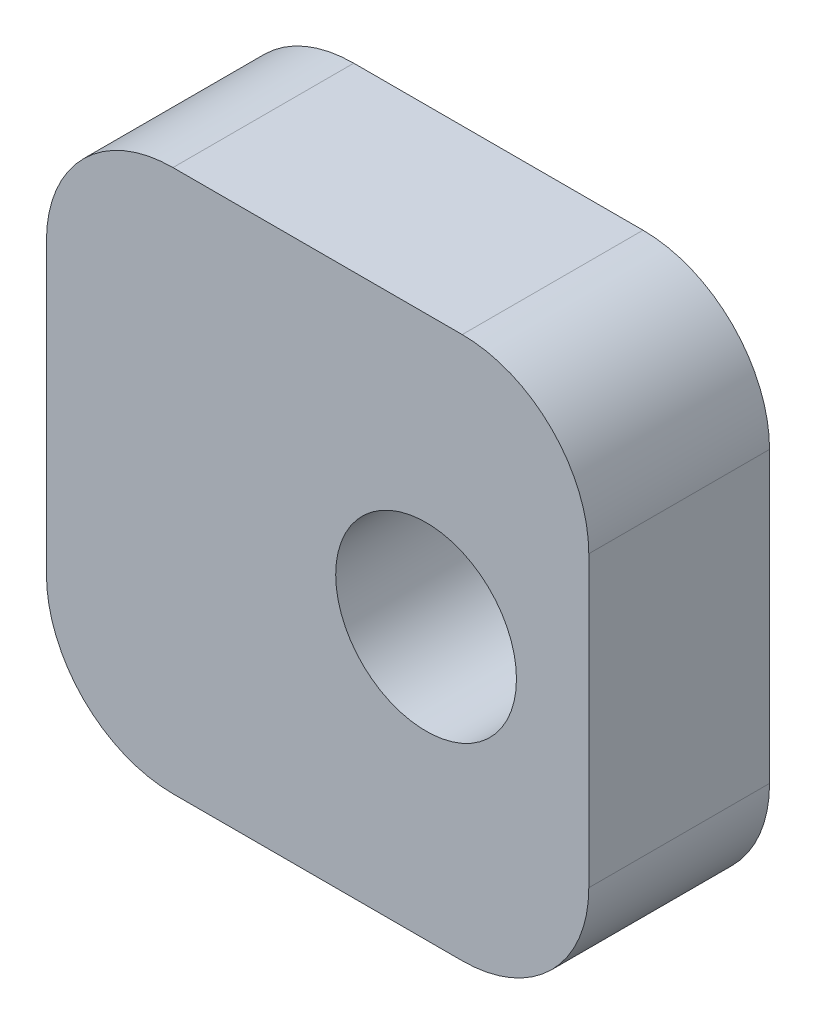
ISO-10303-21;
HEADER;
FILE_DESCRIPTION(('STEP AP214'),'2;1');
FILE_NAME('part.step','',(''),(''),'','','');
FILE_SCHEMA(('AUTOMOTIVE_DESIGN { 1 0 10303 214 1 1 1 1 }'));
ENDSEC;
DATA;
#1=APPLICATION_CONTEXT('core data for automotive mechanical design processes');
#2=APPLICATION_PROTOCOL_DEFINITION('international standard','automotive_design',2000,#1);
#3=PRODUCT_CONTEXT('',#1,'mechanical');
#4=PRODUCT('Part','Part','',(#3));
#5=PRODUCT_RELATED_PRODUCT_CATEGORY('part','',(#4));
#6=PRODUCT_DEFINITION_FORMATION('','',#4);
#7=PRODUCT_DEFINITION_CONTEXT('part definition',#1,'design');
#8=PRODUCT_DEFINITION('design','',#6,#7);
#9=PRODUCT_DEFINITION_SHAPE('','',#8);
#10=(LENGTH_UNIT() NAMED_UNIT(*) SI_UNIT(.MILLI.,.METRE.));
#11=(NAMED_UNIT(*) PLANE_ANGLE_UNIT() SI_UNIT($,.RADIAN.));
#12=(NAMED_UNIT(*) SI_UNIT($,.STERADIAN.) SOLID_ANGLE_UNIT());
#13=UNCERTAINTY_MEASURE_WITH_UNIT(LENGTH_MEASURE(1.E-05),#10,'distance_accuracy_value','');
#14=(GEOMETRIC_REPRESENTATION_CONTEXT(3) GLOBAL_UNCERTAINTY_ASSIGNED_CONTEXT((#13)) GLOBAL_UNIT_ASSIGNED_CONTEXT((#10,
#11,#12)) REPRESENTATION_CONTEXT('',''));
#15=CARTESIAN_POINT('',(0.,0.,0.));
#16=DIRECTION('',(0.,0.,1.));
#17=DIRECTION('',(1.,0.,0.));
#18=AXIS2_PLACEMENT_3D('',#15,#16,#17);
#19=CARTESIAN_POINT('',(0.,0.,10.));
#20=DIRECTION('',(1.,0.,0.));
#21=DIRECTION('',(0.,0.,-1.));
#22=AXIS2_PLACEMENT_3D('',#19,#20,#21);
#23=PLANE('',#22);
#24=CARTESIAN_POINT('',(0.,15.,5.));
#25=DIRECTION('',(-1.,0.,0.));
#26=DIRECTION('',(0.,0.,1.));
#27=AXIS2_PLACEMENT_3D('',#24,#25,#26);
#28=CIRCLE('',#27,3.);
#29=CARTESIAN_POINT('',(0.,15.,8.));
#30=VERTEX_POINT('',#29);
#31=EDGE_CURVE('E180',#30,#30,#28,.T.);
#32=ORIENTED_EDGE('',*,*,#31,.F.);
#33=EDGE_LOOP('',(#32));
#34=FACE_BOUND('',#33,.T.);
#35=DIRECTION('',(0.,-1.,0.));
#36=VECTOR('',#35,1.);
#37=CARTESIAN_POINT('',(0.,0.,10.));
#38=LINE('',#37,#36);
#39=CARTESIAN_POINT('',(0.,23.,10.));
#40=VERTEX_POINT('',#39);
#41=CARTESIAN_POINT('',(0.,7.,10.));
#42=VERTEX_POINT('',#41);
#43=EDGE_CURVE('E129',#40,#42,#38,.T.);
#44=ORIENTED_EDGE('',*,*,#43,.F.);
#45=DIRECTION('',(0.,0.,-1.));
#46=VECTOR('',#45,1.);
#47=CARTESIAN_POINT('',(0.,23.,10.));
#48=LINE('',#47,#46);
#49=CARTESIAN_POINT('',(0.,23.,0.));
#50=VERTEX_POINT('',#49);
#51=EDGE_CURVE('E155',#40,#50,#48,.T.);
#52=ORIENTED_EDGE('',*,*,#51,.T.);
#53=DIRECTION('',(0.,-1.,0.));
#54=VECTOR('',#53,1.);
#55=CARTESIAN_POINT('',(0.,0.,0.));
#56=LINE('',#55,#54);
#57=CARTESIAN_POINT('',(0.,7.,0.));
#58=VERTEX_POINT('',#57);
#59=EDGE_CURVE('E161',#50,#58,#56,.T.);
#60=ORIENTED_EDGE('',*,*,#59,.T.);
#61=DIRECTION('',(0.,0.,-1.));
#62=VECTOR('',#61,1.);
#63=CARTESIAN_POINT('',(0.,7.,10.));
#64=LINE('',#63,#62);
#65=EDGE_CURVE('E153',#58,#42,#64,.F.);
#66=ORIENTED_EDGE('',*,*,#65,.T.);
#67=EDGE_LOOP('',(#44,#52,#60,#66));
#68=FACE_BOUND('',#67,.T.);
#69=ADVANCED_FACE('F37',(#34,#68),#23,.F.);
#70=CARTESIAN_POINT('',(0.,0.,10.));
#71=DIRECTION('',(0.,1.,0.));
#72=DIRECTION('',(0.,0.,1.));
#73=AXIS2_PLACEMENT_3D('',#70,#71,#72);
#74=PLANE('',#73);
#75=DIRECTION('',(1.,0.,0.));
#76=VECTOR('',#75,1.);
#77=CARTESIAN_POINT('',(0.,0.,10.));
#78=LINE('',#77,#76);
#79=CARTESIAN_POINT('',(7.,0.,10.));
#80=VERTEX_POINT('',#79);
#81=CARTESIAN_POINT('',(23.,0.,10.));
#82=VERTEX_POINT('',#81);
#83=EDGE_CURVE('E132',#80,#82,#78,.T.);
#84=ORIENTED_EDGE('',*,*,#83,.F.);
#85=DIRECTION('',(0.,0.,-1.));
#86=VECTOR('',#85,1.);
#87=CARTESIAN_POINT('',(7.,0.,10.));
#88=LINE('',#87,#86);
#89=CARTESIAN_POINT('',(7.,0.,0.));
#90=VERTEX_POINT('',#89);
#91=EDGE_CURVE('E11',#80,#90,#88,.T.);
#92=ORIENTED_EDGE('',*,*,#91,.T.);
#93=DIRECTION('',(1.,0.,0.));
#94=VECTOR('',#93,1.);
#95=CARTESIAN_POINT('',(0.,0.,0.));
#96=LINE('',#95,#94);
#97=CARTESIAN_POINT('',(23.,0.,0.));
#98=VERTEX_POINT('',#97);
#99=EDGE_CURVE('E134',#90,#98,#96,.T.);
#100=ORIENTED_EDGE('',*,*,#99,.T.);
#101=DIRECTION('',(0.,0.,-1.));
#102=VECTOR('',#101,1.);
#103=CARTESIAN_POINT('',(23.,0.,10.));
#104=LINE('',#103,#102);
#105=EDGE_CURVE('E45',#98,#82,#104,.F.);
#106=ORIENTED_EDGE('',*,*,#105,.T.);
#107=EDGE_LOOP('',(#84,#92,#100,#106));
#108=FACE_BOUND('',#107,.T.);
#109=ADVANCED_FACE('F195',(#108),#74,.F.);
#110=CARTESIAN_POINT('',(30.,0.,10.));
#111=DIRECTION('',(-1.,0.,0.));
#112=DIRECTION('',(0.,0.,1.));
#113=AXIS2_PLACEMENT_3D('',#110,#111,#112);
#114=PLANE('',#113);
#115=DIRECTION('',(0.,1.,0.));
#116=VECTOR('',#115,1.);
#117=CARTESIAN_POINT('',(30.,0.,0.));
#118=LINE('',#117,#116);
#119=CARTESIAN_POINT('',(30.,7.,0.));
#120=VERTEX_POINT('',#119);
#121=CARTESIAN_POINT('',(30.,23.,0.));
#122=VERTEX_POINT('',#121);
#123=EDGE_CURVE('E130',#120,#122,#118,.T.);
#124=ORIENTED_EDGE('',*,*,#123,.T.);
#125=DIRECTION('',(0.,0.,-1.));
#126=VECTOR('',#125,1.);
#127=CARTESIAN_POINT('',(30.,23.,10.));
#128=LINE('',#127,#126);
#129=CARTESIAN_POINT('',(30.,23.,10.));
#130=VERTEX_POINT('',#129);
#131=EDGE_CURVE('E108',#122,#130,#128,.F.);
#132=ORIENTED_EDGE('',*,*,#131,.T.);
#133=DIRECTION('',(0.,1.,0.));
#134=VECTOR('',#133,1.);
#135=CARTESIAN_POINT('',(30.,0.,10.));
#136=LINE('',#135,#134);
#137=CARTESIAN_POINT('',(30.,7.,10.));
#138=VERTEX_POINT('',#137);
#139=EDGE_CURVE('E173',#138,#130,#136,.T.);
#140=ORIENTED_EDGE('',*,*,#139,.F.);
#141=DIRECTION('',(0.,0.,-1.));
#142=VECTOR('',#141,1.);
#143=CARTESIAN_POINT('',(30.,7.,10.));
#144=LINE('',#143,#142);
#145=EDGE_CURVE('E113',#138,#120,#144,.T.);
#146=ORIENTED_EDGE('',*,*,#145,.T.);
#147=EDGE_LOOP('',(#124,#132,#140,#146));
#148=FACE_BOUND('',#147,.T.);
#149=ADVANCED_FACE('F200',(#148),#114,.F.);
#150=CARTESIAN_POINT('',(0.,30.,10.));
#151=DIRECTION('',(0.,-1.,0.));
#152=DIRECTION('',(0.,0.,-1.));
#153=AXIS2_PLACEMENT_3D('',#150,#151,#152);
#154=PLANE('',#153);
#155=DIRECTION('',(-1.,0.,0.));
#156=VECTOR('',#155,1.);
#157=CARTESIAN_POINT('',(0.,30.,10.));
#158=LINE('',#157,#156);
#159=CARTESIAN_POINT('',(23.,30.,10.));
#160=VERTEX_POINT('',#159);
#161=CARTESIAN_POINT('',(7.,30.,10.));
#162=VERTEX_POINT('',#161);
#163=EDGE_CURVE('E123',#160,#162,#158,.T.);
#164=ORIENTED_EDGE('',*,*,#163,.F.);
#165=DIRECTION('',(0.,0.,-1.));
#166=VECTOR('',#165,1.);
#167=CARTESIAN_POINT('',(23.,30.,10.));
#168=LINE('',#167,#166);
#169=CARTESIAN_POINT('',(23.,30.,0.));
#170=VERTEX_POINT('',#169);
#171=EDGE_CURVE('E107',#160,#170,#168,.T.);
#172=ORIENTED_EDGE('',*,*,#171,.T.);
#173=DIRECTION('',(-1.,0.,0.));
#174=VECTOR('',#173,1.);
#175=CARTESIAN_POINT('',(0.,30.,0.));
#176=LINE('',#175,#174);
#177=CARTESIAN_POINT('',(7.,30.,0.));
#178=VERTEX_POINT('',#177);
#179=EDGE_CURVE('E120',#170,#178,#176,.T.);
#180=ORIENTED_EDGE('',*,*,#179,.T.);
#181=DIRECTION('',(0.,0.,-1.));
#182=VECTOR('',#181,1.);
#183=CARTESIAN_POINT('',(7.,30.,10.));
#184=LINE('',#183,#182);
#185=EDGE_CURVE('E125',#178,#162,#184,.F.);
#186=ORIENTED_EDGE('',*,*,#185,.T.);
#187=EDGE_LOOP('',(#164,#172,#180,#186));
#188=FACE_BOUND('',#187,.T.);
#189=ADVANCED_FACE('F119',(#188),#154,.F.);
#190=CARTESIAN_POINT('',(0.,0.,10.));
#191=DIRECTION('',(0.,0.,-1.));
#192=DIRECTION('',(-1.,0.,0.));
#193=AXIS2_PLACEMENT_3D('',#190,#191,#192);
#194=PLANE('',#193);
#195=CARTESIAN_POINT('',(21.,15.,10.));
#196=DIRECTION('',(0.,0.,-1.));
#197=DIRECTION('',(-1.,0.,0.));
#198=AXIS2_PLACEMENT_3D('',#195,#196,#197);
#199=CIRCLE('',#198,5.);
#200=CARTESIAN_POINT('',(16.,15.,10.));
#201=VERTEX_POINT('',#200);
#202=EDGE_CURVE('E166',#201,#201,#199,.F.);
#203=ORIENTED_EDGE('',*,*,#202,.F.);
#204=EDGE_LOOP('',(#203));
#205=FACE_BOUND('',#204,.T.);
#206=ORIENTED_EDGE('',*,*,#139,.T.);
#207=CARTESIAN_POINT('',(23.,23.,10.));
#208=DIRECTION('',(0.,0.,-1.));
#209=DIRECTION('',(-1.,0.,0.));
#210=AXIS2_PLACEMENT_3D('',#207,#208,#209);
#211=CIRCLE('',#210,7.);
#212=EDGE_CURVE('E151',#130,#160,#211,.F.);
#213=ORIENTED_EDGE('',*,*,#212,.T.);
#214=ORIENTED_EDGE('',*,*,#163,.T.);
#215=CARTESIAN_POINT('',(7.,23.,10.));
#216=DIRECTION('',(0.,0.,-1.));
#217=DIRECTION('',(-1.,0.,0.));
#218=AXIS2_PLACEMENT_3D('',#215,#216,#217);
#219=CIRCLE('',#218,7.);
#220=EDGE_CURVE('E149',#162,#40,#219,.F.);
#221=ORIENTED_EDGE('',*,*,#220,.T.);
#222=ORIENTED_EDGE('',*,*,#43,.T.);
#223=CARTESIAN_POINT('',(7.,7.,10.));
#224=DIRECTION('',(0.,0.,-1.));
#225=DIRECTION('',(-1.,0.,0.));
#226=AXIS2_PLACEMENT_3D('',#223,#224,#225);
#227=CIRCLE('',#226,7.);
#228=EDGE_CURVE('E58',#42,#80,#227,.F.);
#229=ORIENTED_EDGE('',*,*,#228,.T.);
#230=ORIENTED_EDGE('',*,*,#83,.T.);
#231=CARTESIAN_POINT('',(23.,7.,10.));
#232=DIRECTION('',(0.,0.,-1.));
#233=DIRECTION('',(-1.,0.,0.));
#234=AXIS2_PLACEMENT_3D('',#231,#232,#233);
#235=CIRCLE('',#234,7.);
#236=EDGE_CURVE('E146',#82,#138,#235,.F.);
#237=ORIENTED_EDGE('',*,*,#236,.T.);
#238=EDGE_LOOP('',(#206,#213,#214,#221,#222,#229,#230,#237));
#239=FACE_BOUND('',#238,.T.);
#240=ADVANCED_FACE('F221',(#205,#239),#194,.F.);
#241=CARTESIAN_POINT('',(0.,0.,0.));
#242=DIRECTION('',(0.,0.,-1.));
#243=DIRECTION('',(-1.,0.,0.));
#244=AXIS2_PLACEMENT_3D('',#241,#242,#243);
#245=PLANE('',#244);
#246=CARTESIAN_POINT('',(21.,15.,0.));
#247=DIRECTION('',(0.,0.,-1.));
#248=DIRECTION('',(-1.,0.,0.));
#249=AXIS2_PLACEMENT_3D('',#246,#247,#248);
#250=CIRCLE('',#249,5.);
#251=CARTESIAN_POINT('',(16.,15.,0.));
#252=VERTEX_POINT('',#251);
#253=EDGE_CURVE('E169',#252,#252,#250,.T.);
#254=ORIENTED_EDGE('',*,*,#253,.F.);
#255=EDGE_LOOP('',(#254));
#256=FACE_BOUND('',#255,.T.);
#257=ORIENTED_EDGE('',*,*,#179,.F.);
#258=CARTESIAN_POINT('',(23.,23.,0.));
#259=DIRECTION('',(0.,0.,-1.));
#260=DIRECTION('',(-1.,0.,0.));
#261=AXIS2_PLACEMENT_3D('',#258,#259,#260);
#262=CIRCLE('',#261,7.);
#263=EDGE_CURVE('E103',#170,#122,#262,.T.);
#264=ORIENTED_EDGE('',*,*,#263,.T.);
#265=ORIENTED_EDGE('',*,*,#123,.F.);
#266=CARTESIAN_POINT('',(23.,7.,0.));
#267=DIRECTION('',(0.,0.,-1.));
#268=DIRECTION('',(-1.,0.,0.));
#269=AXIS2_PLACEMENT_3D('',#266,#267,#268);
#270=CIRCLE('',#269,7.);
#271=EDGE_CURVE('E124',#120,#98,#270,.T.);
#272=ORIENTED_EDGE('',*,*,#271,.T.);
#273=ORIENTED_EDGE('',*,*,#99,.F.);
#274=CARTESIAN_POINT('',(7.,7.,0.));
#275=DIRECTION('',(0.,0.,-1.));
#276=DIRECTION('',(-1.,0.,0.));
#277=AXIS2_PLACEMENT_3D('',#274,#275,#276);
#278=CIRCLE('',#277,7.);
#279=EDGE_CURVE('E140',#90,#58,#278,.T.);
#280=ORIENTED_EDGE('',*,*,#279,.T.);
#281=ORIENTED_EDGE('',*,*,#59,.F.);
#282=CARTESIAN_POINT('',(7.,23.,0.));
#283=DIRECTION('',(0.,0.,-1.));
#284=DIRECTION('',(-1.,0.,0.));
#285=AXIS2_PLACEMENT_3D('',#282,#283,#284);
#286=CIRCLE('',#285,7.);
#287=EDGE_CURVE('E114',#50,#178,#286,.T.);
#288=ORIENTED_EDGE('',*,*,#287,.T.);
#289=EDGE_LOOP('',(#257,#264,#265,#272,#273,#280,#281,#288));
#290=FACE_BOUND('',#289,.T.);
#291=ADVANCED_FACE('F127',(#256,#290),#245,.T.);
#292=CARTESIAN_POINT('',(21.,15.,10.001));
#293=DIRECTION('',(0.,0.,-1.));
#294=DIRECTION('',(-1.,0.,0.));
#295=AXIS2_PLACEMENT_3D('',#292,#293,#294);
#296=CYLINDRICAL_SURFACE('',#295,5.);
#297=ORIENTED_EDGE('',*,*,#253,.T.);
#298=EDGE_LOOP('',(#297));
#299=FACE_BOUND('',#298,.T.);
#300=ORIENTED_EDGE('',*,*,#202,.T.);
#301=EDGE_LOOP('',(#300));
#302=FACE_BOUND('',#301,.T.);
#303=ADVANCED_FACE('F207',(#299,#302),#296,.F.);
#304=CARTESIAN_POINT('',(23.,23.,10.));
#305=DIRECTION('',(0.,0.,-1.));
#306=DIRECTION('',(-1.,0.,0.));
#307=AXIS2_PLACEMENT_3D('',#304,#305,#306);
#308=CYLINDRICAL_SURFACE('',#307,7.);
#309=ORIENTED_EDGE('',*,*,#212,.F.);
#310=ORIENTED_EDGE('',*,*,#131,.F.);
#311=ORIENTED_EDGE('',*,*,#263,.F.);
#312=ORIENTED_EDGE('',*,*,#171,.F.);
#313=EDGE_LOOP('',(#309,#310,#311,#312));
#314=FACE_BOUND('',#313,.T.);
#315=ADVANCED_FACE('F106',(#314),#308,.T.);
#316=CARTESIAN_POINT('',(7.,23.,10.));
#317=DIRECTION('',(0.,0.,-1.));
#318=DIRECTION('',(-1.,0.,0.));
#319=AXIS2_PLACEMENT_3D('',#316,#317,#318);
#320=CYLINDRICAL_SURFACE('',#319,7.);
#321=ORIENTED_EDGE('',*,*,#220,.F.);
#322=ORIENTED_EDGE('',*,*,#185,.F.);
#323=ORIENTED_EDGE('',*,*,#287,.F.);
#324=ORIENTED_EDGE('',*,*,#51,.F.);
#325=EDGE_LOOP('',(#321,#322,#323,#324));
#326=FACE_BOUND('',#325,.T.);
#327=ADVANCED_FACE('F206',(#326),#320,.T.);
#328=CARTESIAN_POINT('',(7.,7.,10.));
#329=DIRECTION('',(0.,0.,-1.));
#330=DIRECTION('',(-1.,0.,0.));
#331=AXIS2_PLACEMENT_3D('',#328,#329,#330);
#332=CYLINDRICAL_SURFACE('',#331,7.);
#333=ORIENTED_EDGE('',*,*,#228,.F.);
#334=ORIENTED_EDGE('',*,*,#65,.F.);
#335=ORIENTED_EDGE('',*,*,#279,.F.);
#336=ORIENTED_EDGE('',*,*,#91,.F.);
#337=EDGE_LOOP('',(#333,#334,#335,#336));
#338=FACE_BOUND('',#337,.T.);
#339=ADVANCED_FACE('F209',(#338),#332,.T.);
#340=CARTESIAN_POINT('',(23.,7.,10.));
#341=DIRECTION('',(0.,0.,-1.));
#342=DIRECTION('',(-1.,0.,0.));
#343=AXIS2_PLACEMENT_3D('',#340,#341,#342);
#344=CYLINDRICAL_SURFACE('',#343,7.);
#345=ORIENTED_EDGE('',*,*,#236,.F.);
#346=ORIENTED_EDGE('',*,*,#105,.F.);
#347=ORIENTED_EDGE('',*,*,#271,.F.);
#348=ORIENTED_EDGE('',*,*,#145,.F.);
#349=EDGE_LOOP('',(#345,#346,#347,#348));
#350=FACE_BOUND('',#349,.T.);
#351=ADVANCED_FACE('F39',(#350),#344,.T.);
#352=CARTESIAN_POINT('',(12.,15.,5.));
#353=DIRECTION('',(-1.,0.,0.));
#354=DIRECTION('',(0.,0.,1.));
#355=AXIS2_PLACEMENT_3D('',#352,#353,#354);
#356=CYLINDRICAL_SURFACE('',#355,3.);
#357=CARTESIAN_POINT('',(12.,15.,5.));
#358=DIRECTION('',(-1.,0.,0.));
#359=DIRECTION('',(0.,0.,1.));
#360=AXIS2_PLACEMENT_3D('',#357,#358,#359);
#361=CIRCLE('',#360,3.);
#362=CARTESIAN_POINT('',(12.,15.,8.));
#363=VERTEX_POINT('',#362);
#364=EDGE_CURVE('E179',#363,#363,#361,.T.);
#365=ORIENTED_EDGE('',*,*,#364,.F.);
#366=EDGE_LOOP('',(#365));
#367=FACE_BOUND('',#366,.T.);
#368=ORIENTED_EDGE('',*,*,#31,.T.);
#369=EDGE_LOOP('',(#368));
#370=FACE_BOUND('',#369,.T.);
#371=ADVANCED_FACE('F188',(#367,#370),#356,.F.);
#372=CARTESIAN_POINT('',(12.,15.,5.));
#373=DIRECTION('',(-1.,0.,0.));
#374=DIRECTION('',(0.,0.,1.));
#375=AXIS2_PLACEMENT_3D('',#372,#373,#374);
#376=PLANE('',#375);
#377=ORIENTED_EDGE('',*,*,#364,.T.);
#378=EDGE_LOOP('',(#377));
#379=FACE_BOUND('',#378,.T.);
#380=ADVANCED_FACE('F186',(#379),#376,.T.);
#381=CLOSED_SHELL('',(#69,#109,#149,#189,#240,#291,#303,#315,#327,#339,#351,#371,#380));
#382=MANIFOLD_SOLID_BREP('B2',#381);
#383=ADVANCED_BREP_SHAPE_REPRESENTATION('',(#18,#382),#14);
#384=SHAPE_DEFINITION_REPRESENTATION(#9,#383);
ENDSEC;
END-ISO-10303-21;
